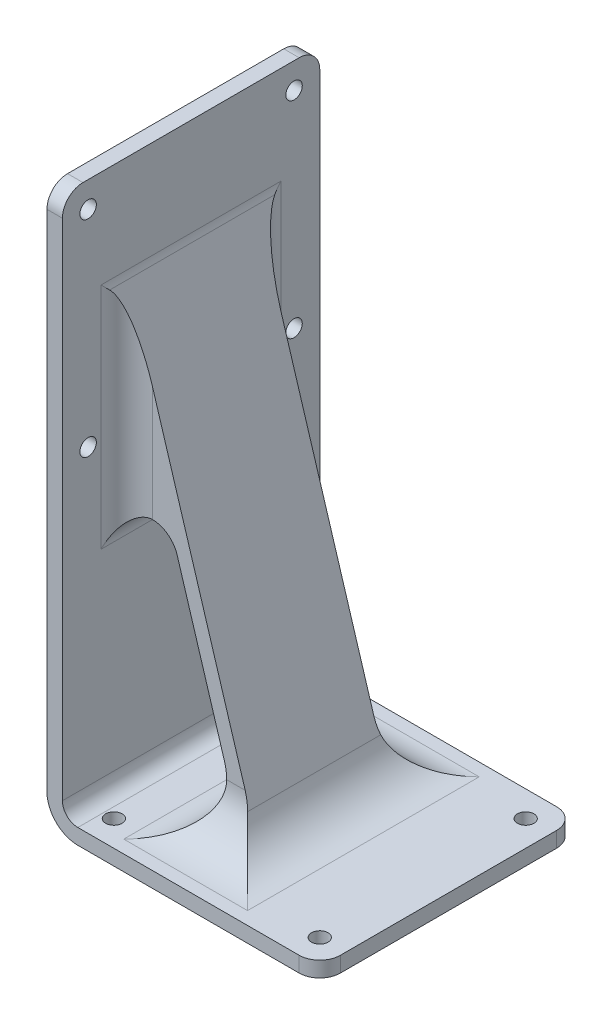
ISO-10303-21;
HEADER;
FILE_DESCRIPTION(('STEP AP214'),'2;1');
FILE_NAME('part.step','',(''),(''),'','','');
FILE_SCHEMA(('AUTOMOTIVE_DESIGN { 1 0 10303 214 1 1 1 1 }'));
ENDSEC;
DATA;
#1=APPLICATION_CONTEXT('core data for automotive mechanical design processes');
#2=APPLICATION_PROTOCOL_DEFINITION('international standard','automotive_design',2000,#1);
#3=PRODUCT_CONTEXT('',#1,'mechanical');
#4=PRODUCT('Part','Part','',(#3));
#5=PRODUCT_RELATED_PRODUCT_CATEGORY('part','',(#4));
#6=PRODUCT_DEFINITION_FORMATION('','',#4);
#7=PRODUCT_DEFINITION_CONTEXT('part definition',#1,'design');
#8=PRODUCT_DEFINITION('design','',#6,#7);
#9=PRODUCT_DEFINITION_SHAPE('','',#8);
#10=(LENGTH_UNIT() NAMED_UNIT(*) SI_UNIT(.MILLI.,.METRE.));
#11=(NAMED_UNIT(*) PLANE_ANGLE_UNIT() SI_UNIT($,.RADIAN.));
#12=(NAMED_UNIT(*) SI_UNIT($,.STERADIAN.) SOLID_ANGLE_UNIT());
#13=UNCERTAINTY_MEASURE_WITH_UNIT(LENGTH_MEASURE(1.E-05),#10,'distance_accuracy_value','');
#14=(GEOMETRIC_REPRESENTATION_CONTEXT(3) GLOBAL_UNCERTAINTY_ASSIGNED_CONTEXT((#13)) GLOBAL_UNIT_ASSIGNED_CONTEXT((#10,
#11,#12)) REPRESENTATION_CONTEXT('',''));
#15=CARTESIAN_POINT('',(0.,0.,0.));
#16=DIRECTION('',(0.,0.,1.));
#17=DIRECTION('',(1.,0.,0.));
#18=AXIS2_PLACEMENT_3D('',#15,#16,#17);
#19=CARTESIAN_POINT('',(0.,3.,0.));
#20=DIRECTION('',(0.,-1.,0.));
#21=DIRECTION('',(0.,0.,-1.));
#22=AXIS2_PLACEMENT_3D('',#19,#20,#21);
#23=PLANE('',#22);
#24=DIRECTION('',(0.,0.,-1.));
#25=VECTOR('',#24,1.);
#26=CARTESIAN_POINT('',(8.46814838501552,3.,12.5));
#27=LINE('',#26,#25);
#28=CARTESIAN_POINT('',(8.46814838501552,3.,-22.5));
#29=VERTEX_POINT('',#28);
#30=CARTESIAN_POINT('',(8.46814838501552,3.,22.5));
#31=VERTEX_POINT('',#30);
#32=EDGE_CURVE('E327',#29,#31,#27,.F.);
#33=ORIENTED_EDGE('',*,*,#32,.T.);
#34=DIRECTION('',(1.,0.,0.));
#35=VECTOR('',#34,1.);
#36=CARTESIAN_POINT('',(-2.06853763473073,3.,22.5));
#37=LINE('',#36,#35);
#38=CARTESIAN_POINT('',(-15.582762014189,3.,22.5));
#39=VERTEX_POINT('',#38);
#40=EDGE_CURVE('E333',#31,#39,#37,.F.);
#41=ORIENTED_EDGE('',*,*,#40,.T.);
#42=DIRECTION('',(0.,0.,-1.));
#43=VECTOR('',#42,1.);
#44=CARTESIAN_POINT('',(-15.582762014189,3.,-12.5));
#45=LINE('',#44,#43);
#46=CARTESIAN_POINT('',(-15.582762014189,3.,-22.5));
#47=VERTEX_POINT('',#46);
#48=EDGE_CURVE('E331',#39,#47,#45,.T.);
#49=ORIENTED_EDGE('',*,*,#48,.T.);
#50=DIRECTION('',(1.,0.,0.));
#51=VECTOR('',#50,1.);
#52=CARTESIAN_POINT('',(0.,3.,-22.5));
#53=LINE('',#52,#51);
#54=EDGE_CURVE('E329',#47,#29,#53,.T.);
#55=ORIENTED_EDGE('',*,*,#54,.T.);
#56=EDGE_LOOP('',(#33,#41,#49,#55));
#57=FACE_BOUND('',#56,.T.);
#58=DIRECTION('',(-1.,0.,0.));
#59=VECTOR('',#58,1.);
#60=CARTESIAN_POINT('',(-25.,3.,-25.));
#61=LINE('',#60,#59);
#62=CARTESIAN_POINT('',(21.,3.,-25.));
#63=VERTEX_POINT('',#62);
#64=CARTESIAN_POINT('',(-22.,3.,-25.));
#65=VERTEX_POINT('',#64);
#66=EDGE_CURVE('E218',#63,#65,#61,.T.);
#67=ORIENTED_EDGE('',*,*,#66,.T.);
#68=DIRECTION('',(0.,0.,-1.));
#69=VECTOR('',#68,1.);
#70=CARTESIAN_POINT('',(-22.,3.,25.));
#71=LINE('',#70,#69);
#72=CARTESIAN_POINT('',(-22.,3.,25.));
#73=VERTEX_POINT('',#72);
#74=EDGE_CURVE('E268',#65,#73,#71,.F.);
#75=ORIENTED_EDGE('',*,*,#74,.T.);
#76=DIRECTION('',(1.,0.,0.));
#77=VECTOR('',#76,1.);
#78=CARTESIAN_POINT('',(-25.,3.,25.));
#79=LINE('',#78,#77);
#80=CARTESIAN_POINT('',(21.,3.,25.));
#81=VERTEX_POINT('',#80);
#82=EDGE_CURVE('E219',#73,#81,#79,.T.);
#83=ORIENTED_EDGE('',*,*,#82,.T.);
#84=CARTESIAN_POINT('',(21.,3.,21.));
#85=DIRECTION('',(0.,-1.,0.));
#86=DIRECTION('',(0.,0.,-1.));
#87=AXIS2_PLACEMENT_3D('',#84,#85,#86);
#88=CIRCLE('',#87,4.);
#89=CARTESIAN_POINT('',(25.,3.,21.));
#90=VERTEX_POINT('',#89);
#91=EDGE_CURVE('E239',#81,#90,#88,.F.);
#92=ORIENTED_EDGE('',*,*,#91,.T.);
#93=DIRECTION('',(0.,0.,-1.));
#94=VECTOR('',#93,1.);
#95=CARTESIAN_POINT('',(25.,3.,25.));
#96=LINE('',#95,#94);
#97=CARTESIAN_POINT('',(25.,3.,-21.));
#98=VERTEX_POINT('',#97);
#99=EDGE_CURVE('E228',#90,#98,#96,.T.);
#100=ORIENTED_EDGE('',*,*,#99,.T.);
#101=CARTESIAN_POINT('',(21.,3.,-21.));
#102=DIRECTION('',(0.,-1.,0.));
#103=DIRECTION('',(0.,0.,-1.));
#104=AXIS2_PLACEMENT_3D('',#101,#102,#103);
#105=CIRCLE('',#104,4.);
#106=EDGE_CURVE('E241',#98,#63,#105,.F.);
#107=ORIENTED_EDGE('',*,*,#106,.T.);
#108=EDGE_LOOP('',(#67,#75,#83,#92,#100,#107));
#109=FACE_BOUND('',#108,.T.);
#110=CARTESIAN_POINT('',(20.,3.,-20.));
#111=DIRECTION('',(0.,1.,0.));
#112=DIRECTION('',(0.,0.,1.));
#113=AXIS2_PLACEMENT_3D('',#110,#111,#112);
#114=CIRCLE('',#113,1.6);
#115=CARTESIAN_POINT('',(20.,3.,-18.4));
#116=VERTEX_POINT('',#115);
#117=EDGE_CURVE('E439',#116,#116,#114,.T.);
#118=ORIENTED_EDGE('',*,*,#117,.F.);
#119=EDGE_LOOP('',(#118));
#120=FACE_BOUND('',#119,.T.);
#121=CARTESIAN_POINT('',(-20.,3.,20.));
#122=DIRECTION('',(0.,1.,0.));
#123=DIRECTION('',(0.,0.,1.));
#124=AXIS2_PLACEMENT_3D('',#121,#122,#123);
#125=CIRCLE('',#124,1.6);
#126=CARTESIAN_POINT('',(-20.,3.,21.6));
#127=VERTEX_POINT('',#126);
#128=EDGE_CURVE('E438',#127,#127,#125,.T.);
#129=ORIENTED_EDGE('',*,*,#128,.F.);
#130=EDGE_LOOP('',(#129));
#131=FACE_BOUND('',#130,.T.);
#132=CARTESIAN_POINT('',(20.,3.,20.));
#133=DIRECTION('',(0.,1.,0.));
#134=DIRECTION('',(0.,0.,1.));
#135=AXIS2_PLACEMENT_3D('',#132,#133,#134);
#136=CIRCLE('',#135,1.6);
#137=CARTESIAN_POINT('',(20.,3.,21.6));
#138=VERTEX_POINT('',#137);
#139=EDGE_CURVE('E432',#138,#138,#136,.T.);
#140=ORIENTED_EDGE('',*,*,#139,.F.);
#141=EDGE_LOOP('',(#140));
#142=FACE_BOUND('',#141,.T.);
#143=CARTESIAN_POINT('',(-20.,3.,-20.));
#144=DIRECTION('',(0.,1.,0.));
#145=DIRECTION('',(0.,0.,1.));
#146=AXIS2_PLACEMENT_3D('',#143,#144,#145);
#147=CIRCLE('',#146,1.6);
#148=CARTESIAN_POINT('',(-20.,3.,-18.4));
#149=VERTEX_POINT('',#148);
#150=EDGE_CURVE('E446',#149,#149,#147,.T.);
#151=ORIENTED_EDGE('',*,*,#150,.F.);
#152=EDGE_LOOP('',(#151));
#153=FACE_BOUND('',#152,.T.);
#154=ADVANCED_FACE('F35',(#57,#109,#120,#131,#142,#153),#23,.F.);
#155=CARTESIAN_POINT('',(-25.,58.,25.));
#156=DIRECTION('',(-1.,0.,0.));
#157=DIRECTION('',(0.,0.,1.));
#158=AXIS2_PLACEMENT_3D('',#155,#156,#157);
#159=PLANE('',#158);
#160=DIRECTION('',(0.,-1.,0.));
#161=VECTOR('',#160,1.);
#162=CARTESIAN_POINT('',(-25.,58.,-17.5));
#163=LINE('',#162,#161);
#164=CARTESIAN_POINT('',(-25.,89.0135995893534,-17.5));
#165=VERTEX_POINT('',#164);
#166=CARTESIAN_POINT('',(-25.,44.5496525315227,-17.5));
#167=VERTEX_POINT('',#166);
#168=EDGE_CURVE('E287',#165,#167,#163,.T.);
#169=ORIENTED_EDGE('',*,*,#168,.T.);
#170=DIRECTION('',(0.,0.,-1.));
#171=VECTOR('',#170,1.);
#172=CARTESIAN_POINT('',(-25.,44.5496525315227,12.5));
#173=LINE('',#172,#171);
#174=CARTESIAN_POINT('',(-25.,44.5496525315227,17.5));
#175=VERTEX_POINT('',#174);
#176=EDGE_CURVE('E291',#167,#175,#173,.F.);
#177=ORIENTED_EDGE('',*,*,#176,.T.);
#178=DIRECTION('',(0.,-1.,0.));
#179=VECTOR('',#178,1.);
#180=CARTESIAN_POINT('',(-25.,88.2663445826078,17.5));
#181=LINE('',#180,#179);
#182=CARTESIAN_POINT('',(-25.,89.0135995893534,17.5));
#183=VERTEX_POINT('',#182);
#184=EDGE_CURVE('E289',#175,#183,#181,.F.);
#185=ORIENTED_EDGE('',*,*,#184,.T.);
#186=DIRECTION('',(0.,0.,-1.));
#187=VECTOR('',#186,1.);
#188=CARTESIAN_POINT('',(-25.,89.0135995893534,-12.5));
#189=LINE('',#188,#187);
#190=EDGE_CURVE('E285',#183,#165,#189,.T.);
#191=ORIENTED_EDGE('',*,*,#190,.T.);
#192=EDGE_LOOP('',(#169,#177,#185,#191));
#193=FACE_BOUND('',#192,.T.);
#194=DIRECTION('',(0.,-1.,0.));
#195=VECTOR('',#194,1.);
#196=CARTESIAN_POINT('',(-25.,58.,25.));
#197=LINE('',#196,#195);
#198=CARTESIAN_POINT('',(-25.,104.,25.));
#199=VERTEX_POINT('',#198);
#200=CARTESIAN_POINT('',(-25.,6.,25.));
#201=VERTEX_POINT('',#200);
#202=EDGE_CURVE('E424',#199,#201,#197,.T.);
#203=ORIENTED_EDGE('',*,*,#202,.T.);
#204=DIRECTION('',(0.,0.,-1.));
#205=VECTOR('',#204,1.);
#206=CARTESIAN_POINT('',(-25.,6.,-25.));
#207=LINE('',#206,#205);
#208=CARTESIAN_POINT('',(-25.,6.,-25.));
#209=VERTEX_POINT('',#208);
#210=EDGE_CURVE('E265',#201,#209,#207,.T.);
#211=ORIENTED_EDGE('',*,*,#210,.T.);
#212=DIRECTION('',(0.,-1.,0.));
#213=VECTOR('',#212,1.);
#214=CARTESIAN_POINT('',(-25.,58.,-25.));
#215=LINE('',#214,#213);
#216=CARTESIAN_POINT('',(-25.,104.,-25.));
#217=VERTEX_POINT('',#216);
#218=EDGE_CURVE('E421',#217,#209,#215,.T.);
#219=ORIENTED_EDGE('',*,*,#218,.F.);
#220=CARTESIAN_POINT('',(-25.,104.,-21.));
#221=DIRECTION('',(-1.,0.,0.));
#222=DIRECTION('',(0.,0.,1.));
#223=AXIS2_PLACEMENT_3D('',#220,#221,#222);
#224=CIRCLE('',#223,4.);
#225=CARTESIAN_POINT('',(-25.,108.,-21.));
#226=VERTEX_POINT('',#225);
#227=EDGE_CURVE('E260',#217,#226,#224,.F.);
#228=ORIENTED_EDGE('',*,*,#227,.T.);
#229=DIRECTION('',(0.,0.,-1.));
#230=VECTOR('',#229,1.);
#231=CARTESIAN_POINT('',(-25.,108.,-25.));
#232=LINE('',#231,#230);
#233=CARTESIAN_POINT('',(-25.,108.,21.));
#234=VERTEX_POINT('',#233);
#235=EDGE_CURVE('E418',#234,#226,#232,.T.);
#236=ORIENTED_EDGE('',*,*,#235,.F.);
#237=CARTESIAN_POINT('',(-25.,104.,21.));
#238=DIRECTION('',(-1.,0.,0.));
#239=DIRECTION('',(0.,0.,1.));
#240=AXIS2_PLACEMENT_3D('',#237,#238,#239);
#241=CIRCLE('',#240,4.);
#242=EDGE_CURVE('E258',#234,#199,#241,.F.);
#243=ORIENTED_EDGE('',*,*,#242,.T.);
#244=EDGE_LOOP('',(#203,#211,#219,#228,#236,#243));
#245=FACE_BOUND('',#244,.T.);
#246=CARTESIAN_POINT('',(-25.,63.,20.));
#247=DIRECTION('',(1.,0.,0.));
#248=DIRECTION('',(0.,0.,-1.));
#249=AXIS2_PLACEMENT_3D('',#246,#247,#248);
#250=CIRCLE('',#249,1.60000000000001);
#251=CARTESIAN_POINT('',(-25.,63.,18.4));
#252=VERTEX_POINT('',#251);
#253=EDGE_CURVE('E398',#252,#252,#250,.T.);
#254=ORIENTED_EDGE('',*,*,#253,.F.);
#255=EDGE_LOOP('',(#254));
#256=FACE_BOUND('',#255,.T.);
#257=CARTESIAN_POINT('',(-25.,103.,20.));
#258=DIRECTION('',(1.,0.,0.));
#259=DIRECTION('',(0.,0.,-1.));
#260=AXIS2_PLACEMENT_3D('',#257,#258,#259);
#261=CIRCLE('',#260,1.60000000000001);
#262=CARTESIAN_POINT('',(-25.,103.,18.4));
#263=VERTEX_POINT('',#262);
#264=EDGE_CURVE('E391',#263,#263,#261,.T.);
#265=ORIENTED_EDGE('',*,*,#264,.F.);
#266=EDGE_LOOP('',(#265));
#267=FACE_BOUND('',#266,.T.);
#268=CARTESIAN_POINT('',(-25.,103.,-20.));
#269=DIRECTION('',(1.,0.,0.));
#270=DIRECTION('',(0.,0.,-1.));
#271=AXIS2_PLACEMENT_3D('',#268,#269,#270);
#272=CIRCLE('',#271,1.60000000000001);
#273=CARTESIAN_POINT('',(-25.,103.,-21.6));
#274=VERTEX_POINT('',#273);
#275=EDGE_CURVE('E399',#274,#274,#272,.T.);
#276=ORIENTED_EDGE('',*,*,#275,.F.);
#277=EDGE_LOOP('',(#276));
#278=FACE_BOUND('',#277,.T.);
#279=CARTESIAN_POINT('',(-25.,63.,-20.));
#280=DIRECTION('',(1.,0.,0.));
#281=DIRECTION('',(0.,0.,-1.));
#282=AXIS2_PLACEMENT_3D('',#279,#280,#281);
#283=CIRCLE('',#282,1.60000000000001);
#284=CARTESIAN_POINT('',(-25.,63.,-21.6));
#285=VERTEX_POINT('',#284);
#286=EDGE_CURVE('E405',#285,#285,#283,.T.);
#287=ORIENTED_EDGE('',*,*,#286,.F.);
#288=EDGE_LOOP('',(#287));
#289=FACE_BOUND('',#288,.T.);
#290=ADVANCED_FACE('F489',(#193,#245,#256,#267,#278,#289),#159,.F.);
#291=CARTESIAN_POINT('',(25.,3.,25.));
#292=DIRECTION('',(-1.,0.,0.));
#293=DIRECTION('',(0.,0.,1.));
#294=AXIS2_PLACEMENT_3D('',#291,#292,#293);
#295=PLANE('',#294);
#296=DIRECTION('',(0.,0.,-1.));
#297=VECTOR('',#296,1.);
#298=CARTESIAN_POINT('',(25.,0.,25.));
#299=LINE('',#298,#297);
#300=CARTESIAN_POINT('',(25.,0.,21.));
#301=VERTEX_POINT('',#300);
#302=CARTESIAN_POINT('',(25.,0.,-21.));
#303=VERTEX_POINT('',#302);
#304=EDGE_CURVE('E226',#301,#303,#299,.T.);
#305=ORIENTED_EDGE('',*,*,#304,.T.);
#306=DIRECTION('',(0.,-1.,0.));
#307=VECTOR('',#306,1.);
#308=CARTESIAN_POINT('',(25.,3.,-21.));
#309=LINE('',#308,#307);
#310=EDGE_CURVE('E203',#303,#98,#309,.F.);
#311=ORIENTED_EDGE('',*,*,#310,.T.);
#312=ORIENTED_EDGE('',*,*,#99,.F.);
#313=DIRECTION('',(0.,-1.,0.));
#314=VECTOR('',#313,1.);
#315=CARTESIAN_POINT('',(25.,3.,21.));
#316=LINE('',#315,#314);
#317=EDGE_CURVE('E208',#90,#301,#316,.T.);
#318=ORIENTED_EDGE('',*,*,#317,.T.);
#319=EDGE_LOOP('',(#305,#311,#312,#318));
#320=FACE_BOUND('',#319,.T.);
#321=ADVANCED_FACE('F471',(#320),#295,.F.);
#322=CARTESIAN_POINT('',(-25.,3.,-25.));
#323=DIRECTION('',(0.,0.,1.));
#324=DIRECTION('',(1.,0.,0.));
#325=AXIS2_PLACEMENT_3D('',#322,#323,#324);
#326=PLANE('',#325);
#327=DIRECTION('',(-1.,0.,0.));
#328=VECTOR('',#327,1.);
#329=CARTESIAN_POINT('',(-25.,0.,-25.));
#330=LINE('',#329,#328);
#331=CARTESIAN_POINT('',(21.,0.,-25.));
#332=VERTEX_POINT('',#331);
#333=CARTESIAN_POINT('',(-22.,0.,-25.));
#334=VERTEX_POINT('',#333);
#335=EDGE_CURVE('E215',#332,#334,#330,.T.);
#336=ORIENTED_EDGE('',*,*,#335,.T.);
#337=CARTESIAN_POINT('',(-22.,6.,-25.));
#338=DIRECTION('',(0.,0.,1.));
#339=DIRECTION('',(1.,0.,0.));
#340=AXIS2_PLACEMENT_3D('',#337,#338,#339);
#341=CIRCLE('',#340,6.);
#342=CARTESIAN_POINT('',(-28.,6.,-25.));
#343=VERTEX_POINT('',#342);
#344=EDGE_CURVE('E280',#334,#343,#341,.F.);
#345=ORIENTED_EDGE('',*,*,#344,.T.);
#346=DIRECTION('',(0.,-1.,0.));
#347=VECTOR('',#346,1.);
#348=CARTESIAN_POINT('',(-28.,3.,-25.));
#349=LINE('',#348,#347);
#350=CARTESIAN_POINT('',(-28.,104.,-25.));
#351=VERTEX_POINT('',#350);
#352=EDGE_CURVE('E427',#351,#343,#349,.T.);
#353=ORIENTED_EDGE('',*,*,#352,.F.);
#354=DIRECTION('',(-1.,0.,0.));
#355=VECTOR('',#354,1.);
#356=CARTESIAN_POINT('',(-25.,104.,-25.));
#357=LINE('',#356,#355);
#358=EDGE_CURVE('E256',#351,#217,#357,.F.);
#359=ORIENTED_EDGE('',*,*,#358,.T.);
#360=ORIENTED_EDGE('',*,*,#218,.T.);
#361=CARTESIAN_POINT('',(-22.,6.,-25.));
#362=DIRECTION('',(0.,0.,1.));
#363=DIRECTION('',(1.,0.,0.));
#364=AXIS2_PLACEMENT_3D('',#361,#362,#363);
#365=CIRCLE('',#364,3.);
#366=EDGE_CURVE('E270',#209,#65,#365,.T.);
#367=ORIENTED_EDGE('',*,*,#366,.T.);
#368=ORIENTED_EDGE('',*,*,#66,.F.);
#369=DIRECTION('',(0.,-1.,0.));
#370=VECTOR('',#369,1.);
#371=CARTESIAN_POINT('',(21.,3.,-25.));
#372=LINE('',#371,#370);
#373=EDGE_CURVE('E202',#63,#332,#372,.T.);
#374=ORIENTED_EDGE('',*,*,#373,.T.);
#375=EDGE_LOOP('',(#336,#345,#353,#359,#360,#367,#368,#374));
#376=FACE_BOUND('',#375,.T.);
#377=ADVANCED_FACE('F214',(#376),#326,.F.);
#378=CARTESIAN_POINT('',(-25.,3.,25.));
#379=DIRECTION('',(0.,0.,-1.));
#380=DIRECTION('',(-1.,0.,0.));
#381=AXIS2_PLACEMENT_3D('',#378,#379,#380);
#382=PLANE('',#381);
#383=DIRECTION('',(0.,1.,0.));
#384=VECTOR('',#383,1.);
#385=CARTESIAN_POINT('',(-28.,3.,25.));
#386=LINE('',#385,#384);
#387=CARTESIAN_POINT('',(-28.,6.,25.));
#388=VERTEX_POINT('',#387);
#389=CARTESIAN_POINT('',(-28.,104.,25.));
#390=VERTEX_POINT('',#389);
#391=EDGE_CURVE('E430',#388,#390,#386,.T.);
#392=ORIENTED_EDGE('',*,*,#391,.F.);
#393=CARTESIAN_POINT('',(-22.,6.,25.));
#394=DIRECTION('',(0.,0.,-1.));
#395=DIRECTION('',(-1.,0.,0.));
#396=AXIS2_PLACEMENT_3D('',#393,#394,#395);
#397=CIRCLE('',#396,6.);
#398=CARTESIAN_POINT('',(-22.,0.,25.));
#399=VERTEX_POINT('',#398);
#400=EDGE_CURVE('E277',#388,#399,#397,.F.);
#401=ORIENTED_EDGE('',*,*,#400,.T.);
#402=DIRECTION('',(1.,0.,0.));
#403=VECTOR('',#402,1.);
#404=CARTESIAN_POINT('',(-25.,0.,25.));
#405=LINE('',#404,#403);
#406=CARTESIAN_POINT('',(21.,0.,25.));
#407=VERTEX_POINT('',#406);
#408=EDGE_CURVE('E225',#399,#407,#405,.T.);
#409=ORIENTED_EDGE('',*,*,#408,.T.);
#410=DIRECTION('',(0.,-1.,0.));
#411=VECTOR('',#410,1.);
#412=CARTESIAN_POINT('',(21.,3.,25.));
#413=LINE('',#412,#411);
#414=EDGE_CURVE('E243',#407,#81,#413,.F.);
#415=ORIENTED_EDGE('',*,*,#414,.T.);
#416=ORIENTED_EDGE('',*,*,#82,.F.);
#417=CARTESIAN_POINT('',(-22.,6.,25.));
#418=DIRECTION('',(0.,0.,-1.));
#419=DIRECTION('',(-1.,0.,0.));
#420=AXIS2_PLACEMENT_3D('',#417,#418,#419);
#421=CIRCLE('',#420,3.);
#422=EDGE_CURVE('E272',#73,#201,#421,.T.);
#423=ORIENTED_EDGE('',*,*,#422,.T.);
#424=ORIENTED_EDGE('',*,*,#202,.F.);
#425=DIRECTION('',(1.,0.,0.));
#426=VECTOR('',#425,1.);
#427=CARTESIAN_POINT('',(-28.,104.,25.));
#428=LINE('',#427,#426);
#429=EDGE_CURVE('E262',#199,#390,#428,.F.);
#430=ORIENTED_EDGE('',*,*,#429,.T.);
#431=EDGE_LOOP('',(#392,#401,#409,#415,#416,#423,#424,#430));
#432=FACE_BOUND('',#431,.T.);
#433=ADVANCED_FACE('F466',(#432),#382,.F.);
#434=CARTESIAN_POINT('',(0.,0.,0.));
#435=DIRECTION('',(0.,-1.,0.));
#436=DIRECTION('',(0.,0.,-1.));
#437=AXIS2_PLACEMENT_3D('',#434,#435,#436);
#438=PLANE('',#437);
#439=CARTESIAN_POINT('',(20.,0.,-20.));
#440=DIRECTION('',(0.,-1.,0.));
#441=DIRECTION('',(0.,0.,-1.));
#442=AXIS2_PLACEMENT_3D('',#439,#440,#441);
#443=CIRCLE('',#442,1.6);
#444=CARTESIAN_POINT('',(20.,0.,-21.6));
#445=VERTEX_POINT('',#444);
#446=EDGE_CURVE('E442',#445,#445,#443,.F.);
#447=ORIENTED_EDGE('',*,*,#446,.T.);
#448=EDGE_LOOP('',(#447));
#449=FACE_BOUND('',#448,.T.);
#450=CARTESIAN_POINT('',(-20.,0.,20.));
#451=DIRECTION('',(0.,-1.,0.));
#452=DIRECTION('',(0.,0.,-1.));
#453=AXIS2_PLACEMENT_3D('',#450,#451,#452);
#454=CIRCLE('',#453,1.6);
#455=CARTESIAN_POINT('',(-20.,0.,18.4));
#456=VERTEX_POINT('',#455);
#457=EDGE_CURVE('E443',#456,#456,#454,.F.);
#458=ORIENTED_EDGE('',*,*,#457,.T.);
#459=EDGE_LOOP('',(#458));
#460=FACE_BOUND('',#459,.T.);
#461=CARTESIAN_POINT('',(20.,0.,20.));
#462=DIRECTION('',(0.,-1.,0.));
#463=DIRECTION('',(0.,0.,-1.));
#464=AXIS2_PLACEMENT_3D('',#461,#462,#463);
#465=CIRCLE('',#464,1.6);
#466=CARTESIAN_POINT('',(20.,0.,18.4));
#467=VERTEX_POINT('',#466);
#468=EDGE_CURVE('E435',#467,#467,#465,.F.);
#469=ORIENTED_EDGE('',*,*,#468,.T.);
#470=EDGE_LOOP('',(#469));
#471=FACE_BOUND('',#470,.T.);
#472=CARTESIAN_POINT('',(-20.,0.,-20.));
#473=DIRECTION('',(0.,-1.,0.));
#474=DIRECTION('',(0.,0.,-1.));
#475=AXIS2_PLACEMENT_3D('',#472,#473,#474);
#476=CIRCLE('',#475,1.6);
#477=CARTESIAN_POINT('',(-20.,0.,-21.6));
#478=VERTEX_POINT('',#477);
#479=EDGE_CURVE('E230',#478,#478,#476,.F.);
#480=ORIENTED_EDGE('',*,*,#479,.T.);
#481=EDGE_LOOP('',(#480));
#482=FACE_BOUND('',#481,.T.);
#483=ORIENTED_EDGE('',*,*,#408,.F.);
#484=DIRECTION('',(0.,0.,1.));
#485=VECTOR('',#484,1.);
#486=CARTESIAN_POINT('',(-22.,0.,-25.));
#487=LINE('',#486,#485);
#488=EDGE_CURVE('E224',#399,#334,#487,.F.);
#489=ORIENTED_EDGE('',*,*,#488,.T.);
#490=ORIENTED_EDGE('',*,*,#335,.F.);
#491=CARTESIAN_POINT('',(21.,0.,-21.));
#492=DIRECTION('',(0.,-1.,0.));
#493=DIRECTION('',(0.,0.,-1.));
#494=AXIS2_PLACEMENT_3D('',#491,#492,#493);
#495=CIRCLE('',#494,4.);
#496=EDGE_CURVE('E198',#332,#303,#495,.T.);
#497=ORIENTED_EDGE('',*,*,#496,.T.);
#498=ORIENTED_EDGE('',*,*,#304,.F.);
#499=CARTESIAN_POINT('',(21.,0.,21.));
#500=DIRECTION('',(0.,-1.,0.));
#501=DIRECTION('',(0.,0.,-1.));
#502=AXIS2_PLACEMENT_3D('',#499,#500,#501);
#503=CIRCLE('',#502,4.);
#504=EDGE_CURVE('E209',#301,#407,#503,.T.);
#505=ORIENTED_EDGE('',*,*,#504,.T.);
#506=EDGE_LOOP('',(#483,#489,#490,#497,#498,#505));
#507=FACE_BOUND('',#506,.T.);
#508=ADVANCED_FACE('F222',(#449,#460,#471,#482,#507),#438,.T.);
#509=CARTESIAN_POINT('',(-20.,-4.52548339959391,-20.));
#510=DIRECTION('',(0.,1.,0.));
#511=DIRECTION('',(0.,0.,1.));
#512=AXIS2_PLACEMENT_3D('',#509,#510,#511);
#513=CYLINDRICAL_SURFACE('',#512,1.6);
#514=ORIENTED_EDGE('',*,*,#150,.T.);
#515=EDGE_LOOP('',(#514));
#516=FACE_BOUND('',#515,.T.);
#517=ORIENTED_EDGE('',*,*,#479,.F.);
#518=EDGE_LOOP('',(#517));
#519=FACE_BOUND('',#518,.T.);
#520=ADVANCED_FACE('F519',(#516,#519),#513,.F.);
#521=CARTESIAN_POINT('',(20.,-4.52548339959391,20.));
#522=DIRECTION('',(0.,1.,0.));
#523=DIRECTION('',(0.,0.,1.));
#524=AXIS2_PLACEMENT_3D('',#521,#522,#523);
#525=CYLINDRICAL_SURFACE('',#524,1.6);
#526=ORIENTED_EDGE('',*,*,#139,.T.);
#527=EDGE_LOOP('',(#526));
#528=FACE_BOUND('',#527,.T.);
#529=ORIENTED_EDGE('',*,*,#468,.F.);
#530=EDGE_LOOP('',(#529));
#531=FACE_BOUND('',#530,.T.);
#532=ADVANCED_FACE('F546',(#528,#531),#525,.F.);
#533=CARTESIAN_POINT('',(-20.,-4.52548339959391,20.));
#534=DIRECTION('',(0.,1.,0.));
#535=DIRECTION('',(0.,0.,1.));
#536=AXIS2_PLACEMENT_3D('',#533,#534,#535);
#537=CYLINDRICAL_SURFACE('',#536,1.6);
#538=ORIENTED_EDGE('',*,*,#128,.T.);
#539=EDGE_LOOP('',(#538));
#540=FACE_BOUND('',#539,.T.);
#541=ORIENTED_EDGE('',*,*,#457,.F.);
#542=EDGE_LOOP('',(#541));
#543=FACE_BOUND('',#542,.T.);
#544=ADVANCED_FACE('F549',(#540,#543),#537,.F.);
#545=CARTESIAN_POINT('',(20.,-4.52548339959391,-20.));
#546=DIRECTION('',(0.,1.,0.));
#547=DIRECTION('',(0.,0.,1.));
#548=AXIS2_PLACEMENT_3D('',#545,#546,#547);
#549=CYLINDRICAL_SURFACE('',#548,1.6);
#550=ORIENTED_EDGE('',*,*,#117,.T.);
#551=EDGE_LOOP('',(#550));
#552=FACE_BOUND('',#551,.T.);
#553=ORIENTED_EDGE('',*,*,#446,.F.);
#554=EDGE_LOOP('',(#553));
#555=FACE_BOUND('',#554,.T.);
#556=ADVANCED_FACE('F532',(#552,#555),#549,.F.);
#557=CARTESIAN_POINT('',(21.,3.,-21.));
#558=DIRECTION('',(0.,-1.,0.));
#559=DIRECTION('',(0.,0.,-1.));
#560=AXIS2_PLACEMENT_3D('',#557,#558,#559);
#561=CYLINDRICAL_SURFACE('',#560,4.);
#562=ORIENTED_EDGE('',*,*,#106,.F.);
#563=ORIENTED_EDGE('',*,*,#310,.F.);
#564=ORIENTED_EDGE('',*,*,#496,.F.);
#565=ORIENTED_EDGE('',*,*,#373,.F.);
#566=EDGE_LOOP('',(#562,#563,#564,#565));
#567=FACE_BOUND('',#566,.T.);
#568=ADVANCED_FACE('F201',(#567),#561,.T.);
#569=CARTESIAN_POINT('',(21.,3.,21.));
#570=DIRECTION('',(0.,-1.,0.));
#571=DIRECTION('',(0.,0.,-1.));
#572=AXIS2_PLACEMENT_3D('',#569,#570,#571);
#573=CYLINDRICAL_SURFACE('',#572,4.);
#574=ORIENTED_EDGE('',*,*,#91,.F.);
#575=ORIENTED_EDGE('',*,*,#414,.F.);
#576=ORIENTED_EDGE('',*,*,#504,.F.);
#577=ORIENTED_EDGE('',*,*,#317,.F.);
#578=EDGE_LOOP('',(#574,#575,#576,#577));
#579=FACE_BOUND('',#578,.T.);
#580=ADVANCED_FACE('F469',(#579),#573,.T.);
#581=CARTESIAN_POINT('',(-28.,0.,0.));
#582=DIRECTION('',(1.,0.,0.));
#583=DIRECTION('',(0.,0.,-1.));
#584=AXIS2_PLACEMENT_3D('',#581,#582,#583);
#585=PLANE('',#584);
#586=CARTESIAN_POINT('',(-28.,63.,-20.));
#587=DIRECTION('',(1.,0.,0.));
#588=DIRECTION('',(0.,0.,-1.));
#589=AXIS2_PLACEMENT_3D('',#586,#587,#588);
#590=CIRCLE('',#589,1.60000000000001);
#591=CARTESIAN_POINT('',(-28.,63.,-21.6));
#592=VERTEX_POINT('',#591);
#593=EDGE_CURVE('E402',#592,#592,#590,.F.);
#594=ORIENTED_EDGE('',*,*,#593,.F.);
#595=EDGE_LOOP('',(#594));
#596=FACE_BOUND('',#595,.T.);
#597=CARTESIAN_POINT('',(-28.,103.,-20.));
#598=DIRECTION('',(1.,0.,0.));
#599=DIRECTION('',(0.,0.,-1.));
#600=AXIS2_PLACEMENT_3D('',#597,#598,#599);
#601=CIRCLE('',#600,1.60000000000001);
#602=CARTESIAN_POINT('',(-28.,103.,-21.6));
#603=VERTEX_POINT('',#602);
#604=EDGE_CURVE('E395',#603,#603,#601,.F.);
#605=ORIENTED_EDGE('',*,*,#604,.F.);
#606=EDGE_LOOP('',(#605));
#607=FACE_BOUND('',#606,.T.);
#608=CARTESIAN_POINT('',(-28.,103.,20.));
#609=DIRECTION('',(1.,0.,0.));
#610=DIRECTION('',(0.,0.,-1.));
#611=AXIS2_PLACEMENT_3D('',#608,#609,#610);
#612=CIRCLE('',#611,1.60000000000001);
#613=CARTESIAN_POINT('',(-28.,103.,18.4));
#614=VERTEX_POINT('',#613);
#615=EDGE_CURVE('E394',#614,#614,#612,.F.);
#616=ORIENTED_EDGE('',*,*,#615,.F.);
#617=EDGE_LOOP('',(#616));
#618=FACE_BOUND('',#617,.T.);
#619=CARTESIAN_POINT('',(-28.,63.,20.));
#620=DIRECTION('',(1.,0.,0.));
#621=DIRECTION('',(0.,0.,-1.));
#622=AXIS2_PLACEMENT_3D('',#619,#620,#621);
#623=CIRCLE('',#622,1.60000000000001);
#624=CARTESIAN_POINT('',(-28.,63.,18.4));
#625=VERTEX_POINT('',#624);
#626=EDGE_CURVE('E412',#625,#625,#623,.F.);
#627=ORIENTED_EDGE('',*,*,#626,.F.);
#628=EDGE_LOOP('',(#627));
#629=FACE_BOUND('',#628,.T.);
#630=ORIENTED_EDGE('',*,*,#352,.T.);
#631=DIRECTION('',(0.,0.,1.));
#632=VECTOR('',#631,1.);
#633=CARTESIAN_POINT('',(-28.,6.,25.));
#634=LINE('',#633,#632);
#635=EDGE_CURVE('E274',#343,#388,#634,.T.);
#636=ORIENTED_EDGE('',*,*,#635,.T.);
#637=ORIENTED_EDGE('',*,*,#391,.T.);
#638=CARTESIAN_POINT('',(-28.,104.,21.));
#639=DIRECTION('',(1.,0.,0.));
#640=DIRECTION('',(0.,0.,-1.));
#641=AXIS2_PLACEMENT_3D('',#638,#639,#640);
#642=CIRCLE('',#641,4.);
#643=CARTESIAN_POINT('',(-28.,108.,21.));
#644=VERTEX_POINT('',#643);
#645=EDGE_CURVE('E252',#390,#644,#642,.F.);
#646=ORIENTED_EDGE('',*,*,#645,.T.);
#647=DIRECTION('',(0.,0.,1.));
#648=VECTOR('',#647,1.);
#649=CARTESIAN_POINT('',(-28.,108.,-25.));
#650=LINE('',#649,#648);
#651=CARTESIAN_POINT('',(-28.,108.,-21.));
#652=VERTEX_POINT('',#651);
#653=EDGE_CURVE('E415',#652,#644,#650,.T.);
#654=ORIENTED_EDGE('',*,*,#653,.F.);
#655=CARTESIAN_POINT('',(-28.,104.,-21.));
#656=DIRECTION('',(1.,0.,0.));
#657=DIRECTION('',(0.,0.,-1.));
#658=AXIS2_PLACEMENT_3D('',#655,#656,#657);
#659=CIRCLE('',#658,4.);
#660=EDGE_CURVE('E254',#652,#351,#659,.F.);
#661=ORIENTED_EDGE('',*,*,#660,.T.);
#662=EDGE_LOOP('',(#630,#636,#637,#646,#654,#661));
#663=FACE_BOUND('',#662,.T.);
#664=ADVANCED_FACE('F478',(#596,#607,#618,#629,#663),#585,.F.);
#665=CARTESIAN_POINT('',(0.,108.,0.));
#666=DIRECTION('',(0.,1.,0.));
#667=DIRECTION('',(0.,0.,1.));
#668=AXIS2_PLACEMENT_3D('',#665,#666,#667);
#669=PLANE('',#668);
#670=ORIENTED_EDGE('',*,*,#235,.T.);
#671=DIRECTION('',(-1.,0.,0.));
#672=VECTOR('',#671,1.);
#673=CARTESIAN_POINT('',(-28.,108.,-21.));
#674=LINE('',#673,#672);
#675=EDGE_CURVE('E249',#226,#652,#674,.T.);
#676=ORIENTED_EDGE('',*,*,#675,.T.);
#677=ORIENTED_EDGE('',*,*,#653,.T.);
#678=DIRECTION('',(1.,0.,0.));
#679=VECTOR('',#678,1.);
#680=CARTESIAN_POINT('',(-25.,108.,21.));
#681=LINE('',#680,#679);
#682=EDGE_CURVE('E246',#644,#234,#681,.T.);
#683=ORIENTED_EDGE('',*,*,#682,.T.);
#684=EDGE_LOOP('',(#670,#676,#677,#683));
#685=FACE_BOUND('',#684,.T.);
#686=ADVANCED_FACE('F485',(#685),#669,.T.);
#687=CARTESIAN_POINT('',(-32.5254833995939,63.,20.));
#688=DIRECTION('',(1.,0.,0.));
#689=DIRECTION('',(0.,0.,-1.));
#690=AXIS2_PLACEMENT_3D('',#687,#688,#689);
#691=CYLINDRICAL_SURFACE('',#690,1.60000000000001);
#692=ORIENTED_EDGE('',*,*,#626,.T.);
#693=EDGE_LOOP('',(#692));
#694=FACE_BOUND('',#693,.T.);
#695=ORIENTED_EDGE('',*,*,#253,.T.);
#696=EDGE_LOOP('',(#695));
#697=FACE_BOUND('',#696,.T.);
#698=ADVANCED_FACE('F541',(#694,#697),#691,.F.);
#699=CARTESIAN_POINT('',(-32.5254833995939,103.,20.));
#700=DIRECTION('',(1.,0.,0.));
#701=DIRECTION('',(0.,0.,-1.));
#702=AXIS2_PLACEMENT_3D('',#699,#700,#701);
#703=CYLINDRICAL_SURFACE('',#702,1.60000000000001);
#704=ORIENTED_EDGE('',*,*,#615,.T.);
#705=EDGE_LOOP('',(#704));
#706=FACE_BOUND('',#705,.T.);
#707=ORIENTED_EDGE('',*,*,#264,.T.);
#708=EDGE_LOOP('',(#707));
#709=FACE_BOUND('',#708,.T.);
#710=ADVANCED_FACE('F613',(#706,#709),#703,.F.);
#711=CARTESIAN_POINT('',(-32.5254833995939,103.,-20.));
#712=DIRECTION('',(1.,0.,0.));
#713=DIRECTION('',(0.,0.,-1.));
#714=AXIS2_PLACEMENT_3D('',#711,#712,#713);
#715=CYLINDRICAL_SURFACE('',#714,1.60000000000001);
#716=ORIENTED_EDGE('',*,*,#604,.T.);
#717=EDGE_LOOP('',(#716));
#718=FACE_BOUND('',#717,.T.);
#719=ORIENTED_EDGE('',*,*,#275,.T.);
#720=EDGE_LOOP('',(#719));
#721=FACE_BOUND('',#720,.T.);
#722=ADVANCED_FACE('F624',(#718,#721),#715,.F.);
#723=CARTESIAN_POINT('',(-32.5254833995939,63.,-20.));
#724=DIRECTION('',(1.,0.,0.));
#725=DIRECTION('',(0.,0.,-1.));
#726=AXIS2_PLACEMENT_3D('',#723,#724,#725);
#727=CYLINDRICAL_SURFACE('',#726,1.60000000000001);
#728=ORIENTED_EDGE('',*,*,#593,.T.);
#729=EDGE_LOOP('',(#728));
#730=FACE_BOUND('',#729,.T.);
#731=ORIENTED_EDGE('',*,*,#286,.T.);
#732=EDGE_LOOP('',(#731));
#733=FACE_BOUND('',#732,.T.);
#734=ADVANCED_FACE('F507',(#730,#733),#727,.F.);
#735=CARTESIAN_POINT('',(0.,104.,-21.));
#736=DIRECTION('',(1.,0.,0.));
#737=DIRECTION('',(0.,0.,-1.));
#738=AXIS2_PLACEMENT_3D('',#735,#736,#737);
#739=CYLINDRICAL_SURFACE('',#738,4.);
#740=ORIENTED_EDGE('',*,*,#227,.F.);
#741=ORIENTED_EDGE('',*,*,#358,.F.);
#742=ORIENTED_EDGE('',*,*,#660,.F.);
#743=ORIENTED_EDGE('',*,*,#675,.F.);
#744=EDGE_LOOP('',(#740,#741,#742,#743));
#745=FACE_BOUND('',#744,.T.);
#746=ADVANCED_FACE('F483',(#745),#739,.T.);
#747=CARTESIAN_POINT('',(0.,104.,21.));
#748=DIRECTION('',(-1.,0.,0.));
#749=DIRECTION('',(0.,0.,1.));
#750=AXIS2_PLACEMENT_3D('',#747,#748,#749);
#751=CYLINDRICAL_SURFACE('',#750,4.);
#752=ORIENTED_EDGE('',*,*,#645,.F.);
#753=ORIENTED_EDGE('',*,*,#429,.F.);
#754=ORIENTED_EDGE('',*,*,#242,.F.);
#755=ORIENTED_EDGE('',*,*,#682,.F.);
#756=EDGE_LOOP('',(#752,#753,#754,#755));
#757=FACE_BOUND('',#756,.T.);
#758=ADVANCED_FACE('F499',(#757),#751,.T.);
#759=CARTESIAN_POINT('',(-22.,6.,25.));
#760=DIRECTION('',(0.,0.,1.));
#761=DIRECTION('',(1.,0.,0.));
#762=AXIS2_PLACEMENT_3D('',#759,#760,#761);
#763=CYLINDRICAL_SURFACE('',#762,3.);
#764=ORIENTED_EDGE('',*,*,#422,.F.);
#765=ORIENTED_EDGE('',*,*,#74,.F.);
#766=ORIENTED_EDGE('',*,*,#366,.F.);
#767=ORIENTED_EDGE('',*,*,#210,.F.);
#768=EDGE_LOOP('',(#764,#765,#766,#767));
#769=FACE_BOUND('',#768,.T.);
#770=ADVANCED_FACE('F495',(#769),#763,.F.);
#771=CARTESIAN_POINT('',(-22.,6.,0.));
#772=DIRECTION('',(0.,0.,-1.));
#773=DIRECTION('',(-1.,0.,0.));
#774=AXIS2_PLACEMENT_3D('',#771,#772,#773);
#775=CYLINDRICAL_SURFACE('',#774,6.);
#776=ORIENTED_EDGE('',*,*,#344,.F.);
#777=ORIENTED_EDGE('',*,*,#488,.F.);
#778=ORIENTED_EDGE('',*,*,#400,.F.);
#779=ORIENTED_EDGE('',*,*,#635,.F.);
#780=EDGE_LOOP('',(#776,#777,#778,#779));
#781=FACE_BOUND('',#780,.T.);
#782=ADVANCED_FACE('F473',(#781),#775,.T.);
#783=CARTESIAN_POINT('',(1.06853763473073,3.00000000000001,12.5));
#784=DIRECTION('',(-0.956304755963032,-0.292371704722748,0.));
#785=DIRECTION('',(0.292371704722748,-0.956304755963032,0.));
#786=AXIS2_PLACEMENT_3D('',#783,#784,#785);
#787=PLANE('',#786);
#788=CARTESIAN_POINT('',(-1.988769179856,13.,22.5));
#789=DIRECTION('',(-0.956304755963032,-0.292371704722748,0.));
#790=DIRECTION('',(-0.292371704722748,0.956304755963032,0.));
#791=AXIS2_PLACEMENT_3D('',#788,#789,#790);
#792=ELLIPSE('',#791,10.4569175648715,10.);
#793=CARTESIAN_POINT('',(-1.988769179856,13.,12.5));
#794=VERTEX_POINT('',#793);
#795=CARTESIAN_POINT('',(-1.0948991746148,10.0762829527725,12.9369524403697));
#796=VERTEX_POINT('',#795);
#797=EDGE_CURVE('E340',#794,#796,#792,.T.);
#798=ORIENTED_EDGE('',*,*,#797,.T.);
#799=DIRECTION('',(0.,0.,-1.));
#800=VECTOR('',#799,1.);
#801=CARTESIAN_POINT('',(-1.0948991746148,10.0762829527725,-12.5));
#802=LINE('',#801,#800);
#803=CARTESIAN_POINT('',(-1.0948991746148,10.0762829527725,-12.9369524403697));
#804=VERTEX_POINT('',#803);
#805=EDGE_CURVE('E51',#796,#804,#802,.T.);
#806=ORIENTED_EDGE('',*,*,#805,.T.);
#807=CARTESIAN_POINT('',(-1.988769179856,13.,-22.5));
#808=DIRECTION('',(-0.956304755963032,-0.292371704722748,0.));
#809=DIRECTION('',(0.292371704722748,-0.956304755963032,0.));
#810=AXIS2_PLACEMENT_3D('',#807,#808,#809);
#811=ELLIPSE('',#810,10.4569175648715,10.);
#812=CARTESIAN_POINT('',(-1.988769179856,13.,-12.5));
#813=VERTEX_POINT('',#812);
#814=EDGE_CURVE('E11',#804,#813,#811,.T.);
#815=ORIENTED_EDGE('',*,*,#814,.T.);
#816=DIRECTION('',(-0.292371704722748,0.956304755963032,0.));
#817=VECTOR('',#816,1.);
#818=CARTESIAN_POINT('',(1.06853763473073,3.00000000000001,-12.5));
#819=LINE('',#818,#817);
#820=CARTESIAN_POINT('',(-20.,71.9120814901878,-12.5));
#821=VERTEX_POINT('',#820);
#822=EDGE_CURVE('E324',#813,#821,#819,.T.);
#823=ORIENTED_EDGE('',*,*,#822,.T.);
#824=CARTESIAN_POINT('',(-20.,71.9120814901878,-17.5));
#825=DIRECTION('',(-0.956304755963032,-0.292371704722748,0.));
#826=DIRECTION('',(0.292371704722748,-0.956304755963032,0.));
#827=AXIS2_PLACEMENT_3D('',#824,#825,#826);
#828=ELLIPSE('',#827,17.1015180991657,5.);
#829=CARTESIAN_POINT('',(-24.7815237798152,87.5517410657397,-16.0381414763862));
#830=VERTEX_POINT('',#829);
#831=EDGE_CURVE('E309',#821,#830,#828,.T.);
#832=ORIENTED_EDGE('',*,*,#831,.T.);
#833=DIRECTION('',(0.,0.,-1.));
#834=VECTOR('',#833,1.);
#835=CARTESIAN_POINT('',(-24.7815237798152,87.5517410657397,12.5));
#836=LINE('',#835,#834);
#837=CARTESIAN_POINT('',(-24.7815237798152,87.5517410657397,16.0381414763862));
#838=VERTEX_POINT('',#837);
#839=EDGE_CURVE('E299',#830,#838,#836,.F.);
#840=ORIENTED_EDGE('',*,*,#839,.T.);
#841=CARTESIAN_POINT('',(-20.,71.9120814901878,17.5));
#842=DIRECTION('',(-0.956304755963032,-0.292371704722748,0.));
#843=DIRECTION('',(-0.292371704722748,0.956304755963032,0.));
#844=AXIS2_PLACEMENT_3D('',#841,#842,#843);
#845=ELLIPSE('',#844,17.1015180991657,5.);
#846=CARTESIAN_POINT('',(-20.,71.9120814901878,12.5));
#847=VERTEX_POINT('',#846);
#848=EDGE_CURVE('E306',#838,#847,#845,.T.);
#849=ORIENTED_EDGE('',*,*,#848,.T.);
#850=DIRECTION('',(-0.292371704722748,0.956304755963032,0.));
#851=VECTOR('',#850,1.);
#852=CARTESIAN_POINT('',(1.06853763473073,3.00000000000001,12.5));
#853=LINE('',#852,#851);
#854=EDGE_CURVE('E373',#794,#847,#853,.T.);
#855=ORIENTED_EDGE('',*,*,#854,.F.);
#856=EDGE_LOOP('',(#798,#806,#815,#823,#832,#840,#849,#855));
#857=FACE_BOUND('',#856,.T.);
#858=ADVANCED_FACE('F372',(#857),#787,.F.);
#859=CARTESIAN_POINT('',(-25.,78.0054337231084,12.5));
#860=DIRECTION('',(0.956304755963032,0.292371704722748,0.));
#861=DIRECTION('',(-0.292371704722748,0.956304755963032,0.));
#862=AXIS2_PLACEMENT_3D('',#859,#860,#861);
#863=PLANE('',#862);
#864=DIRECTION('',(0.292371704722748,-0.956304755963032,0.));
#865=VECTOR('',#864,1.);
#866=CARTESIAN_POINT('',(-25.,78.0054337231084,-12.5));
#867=LINE('',#866,#865);
#868=CARTESIAN_POINT('',(-15.2184762201848,46.0115110551364,-12.5));
#869=VERTEX_POINT('',#868);
#870=CARTESIAN_POINT('',(-6.01971445455866,15.9237170472275,-12.5));
#871=VERTEX_POINT('',#870);
#872=EDGE_CURVE('E385',#869,#871,#867,.T.);
#873=ORIENTED_EDGE('',*,*,#872,.T.);
#874=DIRECTION('',(0.,0.,-1.));
#875=VECTOR('',#874,1.);
#876=CARTESIAN_POINT('',(-6.01971445455866,15.9237170472275,12.5));
#877=LINE('',#876,#875);
#878=CARTESIAN_POINT('',(-6.01971445455866,15.9237170472275,12.5));
#879=VERTEX_POINT('',#878);
#880=EDGE_CURVE('E336',#871,#879,#877,.F.);
#881=ORIENTED_EDGE('',*,*,#880,.T.);
#882=DIRECTION('',(0.292371704722748,-0.956304755963032,0.));
#883=VECTOR('',#882,1.);
#884=CARTESIAN_POINT('',(-25.,78.0054337231084,12.5));
#885=LINE('',#884,#883);
#886=CARTESIAN_POINT('',(-15.2184762201848,46.0115110551364,12.5));
#887=VERTEX_POINT('',#886);
#888=EDGE_CURVE('E379',#887,#879,#885,.T.);
#889=ORIENTED_EDGE('',*,*,#888,.F.);
#890=DIRECTION('',(0.,0.,-1.));
#891=VECTOR('',#890,1.);
#892=CARTESIAN_POINT('',(-15.2184762201848,46.0115110551364,-12.5));
#893=LINE('',#892,#891);
#894=EDGE_CURVE('E282',#887,#869,#893,.T.);
#895=ORIENTED_EDGE('',*,*,#894,.T.);
#896=EDGE_LOOP('',(#873,#881,#889,#895));
#897=FACE_BOUND('',#896,.T.);
#898=ADVANCED_FACE('F382',(#897),#863,.F.);
#899=CARTESIAN_POINT('',(0.,0.,12.5));
#900=DIRECTION('',(0.,0.,-1.));
#901=DIRECTION('',(-1.,0.,0.));
#902=AXIS2_PLACEMENT_3D('',#899,#900,#901);
#903=PLANE('',#902);
#904=ORIENTED_EDGE('',*,*,#888,.T.);
#905=CARTESIAN_POINT('',(-15.582762014189,13.,12.5));
#906=DIRECTION('',(0.,0.,-1.));
#907=DIRECTION('',(-1.,0.,0.));
#908=AXIS2_PLACEMENT_3D('',#905,#906,#907);
#909=CIRCLE('',#908,10.);
#910=CARTESIAN_POINT('',(-5.58276201418899,13.,12.5));
#911=VERTEX_POINT('',#910);
#912=EDGE_CURVE('E44',#879,#911,#909,.T.);
#913=ORIENTED_EDGE('',*,*,#912,.T.);
#914=DIRECTION('',(1.,0.,0.));
#915=VECTOR('',#914,1.);
#916=CARTESIAN_POINT('',(1.06853763473073,13.,12.5));
#917=LINE('',#916,#915);
#918=EDGE_CURVE('E312',#911,#794,#917,.T.);
#919=ORIENTED_EDGE('',*,*,#918,.T.);
#920=ORIENTED_EDGE('',*,*,#854,.T.);
#921=DIRECTION('',(0.,-1.,0.));
#922=VECTOR('',#921,1.);
#923=CARTESIAN_POINT('',(-20.,78.0054337231084,12.5));
#924=LINE('',#923,#922);
#925=CARTESIAN_POINT('',(-20.,49.5496525315227,12.5));
#926=VERTEX_POINT('',#925);
#927=EDGE_CURVE('E294',#847,#926,#924,.T.);
#928=ORIENTED_EDGE('',*,*,#927,.T.);
#929=CARTESIAN_POINT('',(-20.,44.5496525315227,12.5));
#930=DIRECTION('',(0.,0.,-1.));
#931=DIRECTION('',(-1.,0.,0.));
#932=AXIS2_PLACEMENT_3D('',#929,#930,#931);
#933=CIRCLE('',#932,5.);
#934=EDGE_CURVE('E304',#926,#887,#933,.T.);
#935=ORIENTED_EDGE('',*,*,#934,.T.);
#936=EDGE_LOOP('',(#904,#913,#919,#920,#928,#935));
#937=FACE_BOUND('',#936,.T.);
#938=ADVANCED_FACE('F376',(#937),#903,.F.);
#939=CARTESIAN_POINT('',(0.,0.,-12.5));
#940=DIRECTION('',(0.,0.,-1.));
#941=DIRECTION('',(-1.,0.,0.));
#942=AXIS2_PLACEMENT_3D('',#939,#940,#941);
#943=PLANE('',#942);
#944=ORIENTED_EDGE('',*,*,#822,.F.);
#945=DIRECTION('',(1.,0.,0.));
#946=VECTOR('',#945,1.);
#947=CARTESIAN_POINT('',(0.,13.,-12.5));
#948=LINE('',#947,#946);
#949=CARTESIAN_POINT('',(-5.58276201418899,13.,-12.5));
#950=VERTEX_POINT('',#949);
#951=EDGE_CURVE('E59',#813,#950,#948,.F.);
#952=ORIENTED_EDGE('',*,*,#951,.T.);
#953=CARTESIAN_POINT('',(-15.582762014189,13.,-12.5));
#954=DIRECTION('',(0.,0.,-1.));
#955=DIRECTION('',(-1.,0.,0.));
#956=AXIS2_PLACEMENT_3D('',#953,#954,#955);
#957=CIRCLE('',#956,10.);
#958=EDGE_CURVE('E342',#950,#871,#957,.F.);
#959=ORIENTED_EDGE('',*,*,#958,.T.);
#960=ORIENTED_EDGE('',*,*,#872,.F.);
#961=CARTESIAN_POINT('',(-20.,44.5496525315227,-12.5));
#962=DIRECTION('',(0.,0.,-1.));
#963=DIRECTION('',(-1.,0.,0.));
#964=AXIS2_PLACEMENT_3D('',#961,#962,#963);
#965=CIRCLE('',#964,5.);
#966=CARTESIAN_POINT('',(-20.,49.5496525315227,-12.5));
#967=VERTEX_POINT('',#966);
#968=EDGE_CURVE('E301',#869,#967,#965,.F.);
#969=ORIENTED_EDGE('',*,*,#968,.T.);
#970=DIRECTION('',(0.,-1.,0.));
#971=VECTOR('',#970,1.);
#972=CARTESIAN_POINT('',(-20.,0.,-12.5));
#973=LINE('',#972,#971);
#974=EDGE_CURVE('E296',#967,#821,#973,.F.);
#975=ORIENTED_EDGE('',*,*,#974,.T.);
#976=EDGE_LOOP('',(#944,#952,#959,#960,#969,#975));
#977=FACE_BOUND('',#976,.T.);
#978=ADVANCED_FACE('F720',(#977),#943,.T.);
#979=CARTESIAN_POINT('',(-20.,89.0135995893534,25.));
#980=DIRECTION('',(0.,0.,1.));
#981=DIRECTION('',(1.,0.,0.));
#982=AXIS2_PLACEMENT_3D('',#979,#980,#981);
#983=CYLINDRICAL_SURFACE('',#982,5.);
#984=CARTESIAN_POINT('',(-20.,89.0135995893534,-17.5));
#985=DIRECTION('',(0.,0.707106781186547,0.707106781186547));
#986=DIRECTION('',(0.,-0.707106781186547,0.707106781186547));
#987=AXIS2_PLACEMENT_3D('',#984,#985,#986);
#988=ELLIPSE('',#987,7.07106781186547,5.);
#989=EDGE_CURVE('E318',#165,#830,#988,.T.);
#990=ORIENTED_EDGE('',*,*,#989,.F.);
#991=ORIENTED_EDGE('',*,*,#190,.F.);
#992=CARTESIAN_POINT('',(-20.,89.0135995893534,17.5));
#993=DIRECTION('',(0.,-0.707106781186547,0.707106781186547));
#994=DIRECTION('',(0.,0.707106781186547,0.707106781186547));
#995=AXIS2_PLACEMENT_3D('',#992,#993,#994);
#996=ELLIPSE('',#995,7.07106781186547,5.);
#997=EDGE_CURVE('E321',#838,#183,#996,.F.);
#998=ORIENTED_EDGE('',*,*,#997,.F.);
#999=ORIENTED_EDGE('',*,*,#839,.F.);
#1000=EDGE_LOOP('',(#990,#991,#998,#999));
#1001=FACE_BOUND('',#1000,.T.);
#1002=ADVANCED_FACE('F714',(#1001),#983,.F.);
#1003=CARTESIAN_POINT('',(-20.,0.,17.5));
#1004=DIRECTION('',(0.,1.,0.));
#1005=DIRECTION('',(0.,0.,1.));
#1006=AXIS2_PLACEMENT_3D('',#1003,#1004,#1005);
#1007=CYLINDRICAL_SURFACE('',#1006,5.);
#1008=ORIENTED_EDGE('',*,*,#997,.T.);
#1009=ORIENTED_EDGE('',*,*,#184,.F.);
#1010=CARTESIAN_POINT('',(-20.,44.5496525315227,17.5));
#1011=DIRECTION('',(0.,0.707106781186547,0.707106781186547));
#1012=DIRECTION('',(0.,0.707106781186547,-0.707106781186547));
#1013=AXIS2_PLACEMENT_3D('',#1010,#1011,#1012);
#1014=ELLIPSE('',#1013,7.07106781186547,5.);
#1015=EDGE_CURVE('E316',#926,#175,#1014,.T.);
#1016=ORIENTED_EDGE('',*,*,#1015,.F.);
#1017=ORIENTED_EDGE('',*,*,#927,.F.);
#1018=ORIENTED_EDGE('',*,*,#848,.F.);
#1019=EDGE_LOOP('',(#1008,#1009,#1016,#1017,#1018));
#1020=FACE_BOUND('',#1019,.T.);
#1021=ADVANCED_FACE('F719',(#1020),#1007,.F.);
#1022=CARTESIAN_POINT('',(-20.,58.,-17.5));
#1023=DIRECTION('',(0.,-1.,0.));
#1024=DIRECTION('',(0.,0.,-1.));
#1025=AXIS2_PLACEMENT_3D('',#1022,#1023,#1024);
#1026=CYLINDRICAL_SURFACE('',#1025,5.);
#1027=ORIENTED_EDGE('',*,*,#974,.F.);
#1028=CARTESIAN_POINT('',(-20.,44.5496525315227,-17.5));
#1029=DIRECTION('',(0.,-0.707106781186547,0.707106781186547));
#1030=DIRECTION('',(0.,-0.707106781186547,-0.707106781186547));
#1031=AXIS2_PLACEMENT_3D('',#1028,#1029,#1030);
#1032=ELLIPSE('',#1031,7.07106781186547,5.);
#1033=EDGE_CURVE('E313',#167,#967,#1032,.F.);
#1034=ORIENTED_EDGE('',*,*,#1033,.F.);
#1035=ORIENTED_EDGE('',*,*,#168,.F.);
#1036=ORIENTED_EDGE('',*,*,#989,.T.);
#1037=ORIENTED_EDGE('',*,*,#831,.F.);
#1038=EDGE_LOOP('',(#1027,#1034,#1035,#1036,#1037));
#1039=FACE_BOUND('',#1038,.T.);
#1040=ADVANCED_FACE('F732',(#1039),#1026,.F.);
#1041=CARTESIAN_POINT('',(-20.,44.5496525315227,12.5));
#1042=DIRECTION('',(0.,0.,1.));
#1043=DIRECTION('',(1.,0.,0.));
#1044=AXIS2_PLACEMENT_3D('',#1041,#1042,#1043);
#1045=CYLINDRICAL_SURFACE('',#1044,5.);
#1046=ORIENTED_EDGE('',*,*,#1015,.T.);
#1047=ORIENTED_EDGE('',*,*,#176,.F.);
#1048=ORIENTED_EDGE('',*,*,#1033,.T.);
#1049=ORIENTED_EDGE('',*,*,#968,.F.);
#1050=ORIENTED_EDGE('',*,*,#894,.F.);
#1051=ORIENTED_EDGE('',*,*,#934,.F.);
#1052=EDGE_LOOP('',(#1046,#1047,#1048,#1049,#1050,#1051));
#1053=FACE_BOUND('',#1052,.T.);
#1054=ADVANCED_FACE('F742',(#1053),#1045,.F.);
#1055=CARTESIAN_POINT('',(0.,13.,-22.5));
#1056=DIRECTION('',(1.,0.,0.));
#1057=DIRECTION('',(0.,0.,-1.));
#1058=AXIS2_PLACEMENT_3D('',#1055,#1056,#1057);
#1059=CYLINDRICAL_SURFACE('',#1058,10.);
#1060=CARTESIAN_POINT('',(8.46814838501552,13.,-22.5));
#1061=DIRECTION('',(0.707106781186548,0.,0.707106781186547));
#1062=DIRECTION('',(-0.707106781186548,0.,0.707106781186547));
#1063=AXIS2_PLACEMENT_3D('',#1060,#1061,#1062);
#1064=ELLIPSE('',#1063,14.1421356237309,10.);
#1065=EDGE_CURVE('E350',#29,#804,#1064,.F.);
#1066=ORIENTED_EDGE('',*,*,#1065,.F.);
#1067=ORIENTED_EDGE('',*,*,#54,.F.);
#1068=CARTESIAN_POINT('',(-15.582762014189,13.,-22.5));
#1069=DIRECTION('',(0.707106781186547,0.,-0.707106781186547));
#1070=DIRECTION('',(0.707106781186547,0.,0.707106781186547));
#1071=AXIS2_PLACEMENT_3D('',#1068,#1069,#1070);
#1072=ELLIPSE('',#1071,14.1421356237309,10.);
#1073=EDGE_CURVE('E39',#950,#47,#1072,.T.);
#1074=ORIENTED_EDGE('',*,*,#1073,.F.);
#1075=ORIENTED_EDGE('',*,*,#951,.F.);
#1076=ORIENTED_EDGE('',*,*,#814,.F.);
#1077=EDGE_LOOP('',(#1066,#1067,#1074,#1075,#1076));
#1078=FACE_BOUND('',#1077,.T.);
#1079=ADVANCED_FACE('F37',(#1078),#1059,.F.);
#1080=CARTESIAN_POINT('',(-15.582762014189,13.,0.));
#1081=DIRECTION('',(0.,0.,1.));
#1082=DIRECTION('',(1.,0.,0.));
#1083=AXIS2_PLACEMENT_3D('',#1080,#1081,#1082);
#1084=CYLINDRICAL_SURFACE('',#1083,10.);
#1085=ORIENTED_EDGE('',*,*,#1073,.T.);
#1086=ORIENTED_EDGE('',*,*,#48,.F.);
#1087=CARTESIAN_POINT('',(-15.582762014189,13.,22.5));
#1088=DIRECTION('',(0.707106781186547,0.,0.707106781186547));
#1089=DIRECTION('',(-0.707106781186547,0.,0.707106781186547));
#1090=AXIS2_PLACEMENT_3D('',#1087,#1088,#1089);
#1091=ELLIPSE('',#1090,14.1421356237309,10.);
#1092=EDGE_CURVE('E349',#911,#39,#1091,.F.);
#1093=ORIENTED_EDGE('',*,*,#1092,.F.);
#1094=ORIENTED_EDGE('',*,*,#912,.F.);
#1095=ORIENTED_EDGE('',*,*,#880,.F.);
#1096=ORIENTED_EDGE('',*,*,#958,.F.);
#1097=EDGE_LOOP('',(#1085,#1086,#1093,#1094,#1095,#1096));
#1098=FACE_BOUND('',#1097,.T.);
#1099=ADVANCED_FACE('F359',(#1098),#1084,.F.);
#1100=CARTESIAN_POINT('',(8.46814838501552,13.,12.5));
#1101=DIRECTION('',(0.,0.,1.));
#1102=DIRECTION('',(1.,0.,0.));
#1103=AXIS2_PLACEMENT_3D('',#1100,#1101,#1102);
#1104=CYLINDRICAL_SURFACE('',#1103,10.);
#1105=ORIENTED_EDGE('',*,*,#805,.F.);
#1106=CARTESIAN_POINT('',(8.46814838501552,13.,22.5));
#1107=DIRECTION('',(-0.707106781186548,0.,0.707106781186547));
#1108=DIRECTION('',(0.707106781186548,0.,0.707106781186547));
#1109=AXIS2_PLACEMENT_3D('',#1106,#1107,#1108);
#1110=ELLIPSE('',#1109,14.1421356237309,10.);
#1111=EDGE_CURVE('E346',#31,#796,#1110,.F.);
#1112=ORIENTED_EDGE('',*,*,#1111,.F.);
#1113=ORIENTED_EDGE('',*,*,#32,.F.);
#1114=ORIENTED_EDGE('',*,*,#1065,.T.);
#1115=EDGE_LOOP('',(#1105,#1112,#1113,#1114));
#1116=FACE_BOUND('',#1115,.T.);
#1117=ADVANCED_FACE('F370',(#1116),#1104,.F.);
#1118=CARTESIAN_POINT('',(0.,13.,22.5));
#1119=DIRECTION('',(-1.,0.,0.));
#1120=DIRECTION('',(0.,0.,1.));
#1121=AXIS2_PLACEMENT_3D('',#1118,#1119,#1120);
#1122=CYLINDRICAL_SURFACE('',#1121,10.);
#1123=ORIENTED_EDGE('',*,*,#1092,.T.);
#1124=ORIENTED_EDGE('',*,*,#40,.F.);
#1125=ORIENTED_EDGE('',*,*,#1111,.T.);
#1126=ORIENTED_EDGE('',*,*,#797,.F.);
#1127=ORIENTED_EDGE('',*,*,#918,.F.);
#1128=EDGE_LOOP('',(#1123,#1124,#1125,#1126,#1127));
#1129=FACE_BOUND('',#1128,.T.);
#1130=ADVANCED_FACE('F369',(#1129),#1122,.F.);
#1131=CLOSED_SHELL('',(#154,#290,#321,#377,#433,#508,#520,#532,#544,#556,#568,#580,#664,#686,
#698,#710,#722,#734,#746,#758,#770,#782,#858,#898,#938,#978,#1002,#1021,#1040,#1054,#1079,#1099,
#1117,#1130));
#1132=MANIFOLD_SOLID_BREP('B2',#1131);
#1133=ADVANCED_BREP_SHAPE_REPRESENTATION('',(#18,#1132),#14);
#1134=SHAPE_DEFINITION_REPRESENTATION(#9,#1133);
ENDSEC;
END-ISO-10303-21;
